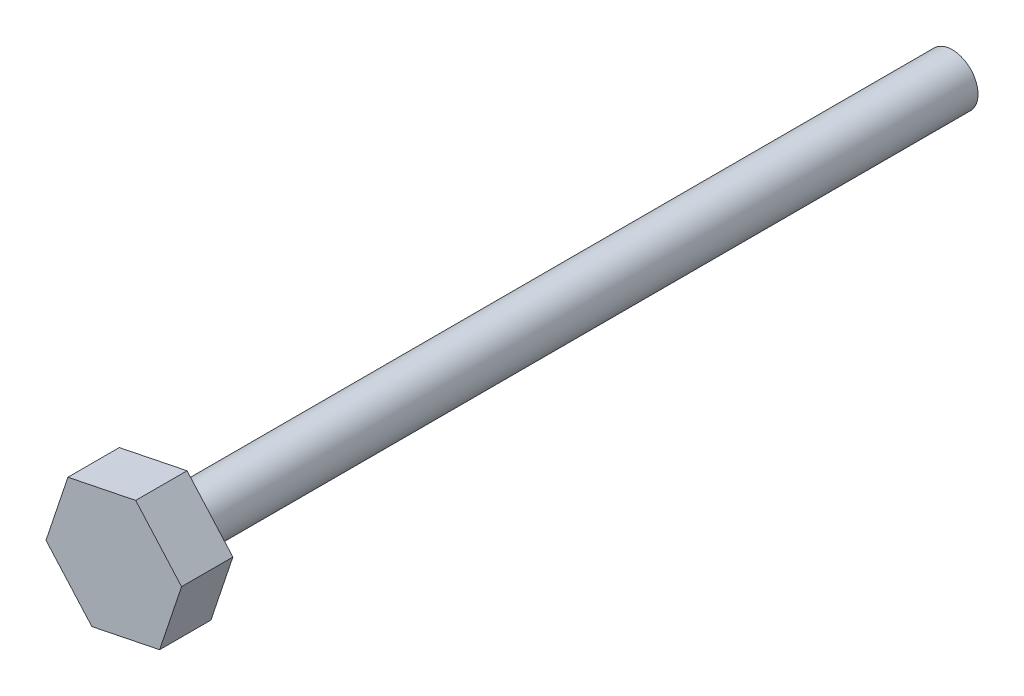
ISO-10303-21;
HEADER;
FILE_DESCRIPTION(('STEP AP214'),'2;1');
FILE_NAME('part.step','',(''),(''),'','','');
FILE_SCHEMA(('AUTOMOTIVE_DESIGN { 1 0 10303 214 1 1 1 1 }'));
ENDSEC;
DATA;
#1=APPLICATION_CONTEXT('core data for automotive mechanical design processes');
#2=APPLICATION_PROTOCOL_DEFINITION('international standard','automotive_design',2000,#1);
#3=PRODUCT_CONTEXT('',#1,'mechanical');
#4=PRODUCT('Part','Part','',(#3));
#5=PRODUCT_RELATED_PRODUCT_CATEGORY('part','',(#4));
#6=PRODUCT_DEFINITION_FORMATION('','',#4);
#7=PRODUCT_DEFINITION_CONTEXT('part definition',#1,'design');
#8=PRODUCT_DEFINITION('design','',#6,#7);
#9=PRODUCT_DEFINITION_SHAPE('','',#8);
#10=(LENGTH_UNIT() NAMED_UNIT(*) SI_UNIT(.MILLI.,.METRE.));
#11=(NAMED_UNIT(*) PLANE_ANGLE_UNIT() SI_UNIT($,.RADIAN.));
#12=(NAMED_UNIT(*) SI_UNIT($,.STERADIAN.) SOLID_ANGLE_UNIT());
#13=UNCERTAINTY_MEASURE_WITH_UNIT(LENGTH_MEASURE(1.E-05),#10,'distance_accuracy_value','');
#14=(GEOMETRIC_REPRESENTATION_CONTEXT(3) GLOBAL_UNCERTAINTY_ASSIGNED_CONTEXT((#13)) GLOBAL_UNIT_ASSIGNED_CONTEXT((#10,
#11,#12)) REPRESENTATION_CONTEXT('',''));
#15=CARTESIAN_POINT('',(0.,0.,0.));
#16=DIRECTION('',(0.,0.,1.));
#17=DIRECTION('',(1.,0.,0.));
#18=AXIS2_PLACEMENT_3D('',#15,#16,#17);
#19=CARTESIAN_POINT('',(0.,0.,46.));
#20=DIRECTION('',(0.,0.,-1.));
#21=DIRECTION('',(-1.,0.,0.));
#22=AXIS2_PLACEMENT_3D('',#19,#20,#21);
#23=CYLINDRICAL_SURFACE('',#22,1.5);
#24=CARTESIAN_POINT('',(0.,0.,46.));
#25=DIRECTION('',(0.,0.,1.));
#26=DIRECTION('',(1.,0.,0.));
#27=AXIS2_PLACEMENT_3D('',#24,#25,#26);
#28=CIRCLE('',#27,1.5);
#29=CARTESIAN_POINT('',(1.5,0.,46.));
#30=VERTEX_POINT('',#29);
#31=EDGE_CURVE('E11',#30,#30,#28,.T.);
#32=ORIENTED_EDGE('',*,*,#31,.F.);
#33=EDGE_LOOP('',(#32));
#34=FACE_BOUND('',#33,.T.);
#35=CARTESIAN_POINT('',(0.,0.,0.));
#36=DIRECTION('',(0.,0.,1.));
#37=DIRECTION('',(1.,0.,0.));
#38=AXIS2_PLACEMENT_3D('',#35,#36,#37);
#39=CIRCLE('',#38,1.5);
#40=CARTESIAN_POINT('',(1.5,0.,0.));
#41=VERTEX_POINT('',#40);
#42=EDGE_CURVE('E36',#41,#41,#39,.T.);
#43=ORIENTED_EDGE('',*,*,#42,.T.);
#44=EDGE_LOOP('',(#43));
#45=FACE_BOUND('',#44,.T.);
#46=ADVANCED_FACE('F33',(#34,#45),#23,.T.);
#47=CARTESIAN_POINT('',(0.,0.,0.));
#48=DIRECTION('',(0.,0.,1.));
#49=DIRECTION('',(1.,0.,0.));
#50=AXIS2_PLACEMENT_3D('',#47,#48,#49);
#51=PLANE('',#50);
#52=ORIENTED_EDGE('',*,*,#42,.F.);
#53=EDGE_LOOP('',(#52));
#54=FACE_BOUND('',#53,.T.);
#55=ADVANCED_FACE('F141',(#54),#51,.F.);
#56=CARTESIAN_POINT('',(3.9601018851663,0.806800094469266,49.));
#57=DIRECTION('',(-0.748777635737627,-0.662821282261795,0.));
#58=DIRECTION('',(0.662821282261795,-0.748777635737627,0.));
#59=AXIS2_PLACEMENT_3D('',#56,#57,#58);
#60=PLANE('',#59);
#61=DIRECTION('',(-0.662821282261795,0.748777635737627,0.));
#62=VECTOR('',#61,1.);
#63=CARTESIAN_POINT('',(3.9601018851663,0.806800094469266,46.));
#64=LINE('',#63,#62);
#65=CARTESIAN_POINT('',(3.9601018851663,0.806800094469266,46.));
#66=VERTEX_POINT('',#65);
#67=CARTESIAN_POINT('',(1.28134156499708,3.8329488813633,46.));
#68=VERTEX_POINT('',#67);
#69=EDGE_CURVE('E118',#66,#68,#64,.T.);
#70=ORIENTED_EDGE('',*,*,#69,.T.);
#71=DIRECTION('',(0.,0.,-1.));
#72=VECTOR('',#71,1.);
#73=CARTESIAN_POINT('',(1.28134156499708,3.8329488813633,49.));
#74=LINE('',#73,#72);
#75=CARTESIAN_POINT('',(1.28134156499708,3.8329488813633,49.));
#76=VERTEX_POINT('',#75);
#77=EDGE_CURVE('E135',#76,#68,#74,.T.);
#78=ORIENTED_EDGE('',*,*,#77,.F.);
#79=DIRECTION('',(-0.662821282261795,0.748777635737627,0.));
#80=VECTOR('',#79,1.);
#81=CARTESIAN_POINT('',(3.9601018851663,0.806800094469266,49.));
#82=LINE('',#81,#80);
#83=CARTESIAN_POINT('',(3.9601018851663,0.806800094469266,49.));
#84=VERTEX_POINT('',#83);
#85=EDGE_CURVE('E128',#84,#76,#82,.T.);
#86=ORIENTED_EDGE('',*,*,#85,.F.);
#87=DIRECTION('',(0.,0.,-1.));
#88=VECTOR('',#87,1.);
#89=CARTESIAN_POINT('',(3.9601018851663,0.806800094469266,49.));
#90=LINE('',#89,#88);
#91=EDGE_CURVE('E114',#84,#66,#90,.T.);
#92=ORIENTED_EDGE('',*,*,#91,.T.);
#93=EDGE_LOOP('',(#70,#78,#86,#92));
#94=FACE_BOUND('',#93,.T.);
#95=ADVANCED_FACE('F143',(#94),#60,.F.);
#96=CARTESIAN_POINT('',(1.28134156499708,3.8329488813633,49.));
#97=DIRECTION('',(0.199631250738877,-0.979871095465333,0.));
#98=DIRECTION('',(0.979871095465333,0.199631250738877,0.));
#99=AXIS2_PLACEMENT_3D('',#96,#97,#98);
#100=PLANE('',#99);
#101=DIRECTION('',(-0.979871095465333,-0.199631250738877,0.));
#102=VECTOR('',#101,1.);
#103=CARTESIAN_POINT('',(1.28134156499708,3.8329488813633,46.));
#104=LINE('',#103,#102);
#105=CARTESIAN_POINT('',(-2.67876032016922,3.02614878689403,46.));
#106=VERTEX_POINT('',#105);
#107=EDGE_CURVE('E121',#68,#106,#104,.T.);
#108=ORIENTED_EDGE('',*,*,#107,.T.);
#109=DIRECTION('',(0.,0.,-1.));
#110=VECTOR('',#109,1.);
#111=CARTESIAN_POINT('',(-2.67876032016922,3.02614878689403,49.));
#112=LINE('',#111,#110);
#113=CARTESIAN_POINT('',(-2.67876032016922,3.02614878689403,49.));
#114=VERTEX_POINT('',#113);
#115=EDGE_CURVE('E132',#114,#106,#112,.T.);
#116=ORIENTED_EDGE('',*,*,#115,.F.);
#117=DIRECTION('',(-0.979871095465333,-0.199631250738877,0.));
#118=VECTOR('',#117,1.);
#119=CARTESIAN_POINT('',(1.28134156499708,3.8329488813633,49.));
#120=LINE('',#119,#118);
#121=EDGE_CURVE('E87',#76,#114,#120,.T.);
#122=ORIENTED_EDGE('',*,*,#121,.F.);
#123=ORIENTED_EDGE('',*,*,#77,.T.);
#124=EDGE_LOOP('',(#108,#116,#122,#123));
#125=FACE_BOUND('',#124,.T.);
#126=ADVANCED_FACE('F148',(#125),#100,.F.);
#127=CARTESIAN_POINT('',(-2.67876032016922,3.02614878689403,49.));
#128=DIRECTION('',(0.948408886476504,-0.317049813203538,0.));
#129=DIRECTION('',(0.317049813203538,0.948408886476504,0.));
#130=AXIS2_PLACEMENT_3D('',#127,#128,#129);
#131=PLANE('',#130);
#132=DIRECTION('',(-0.317049813203538,-0.948408886476504,0.));
#133=VECTOR('',#132,1.);
#134=CARTESIAN_POINT('',(-2.67876032016922,3.02614878689403,46.));
#135=LINE('',#134,#133);
#136=CARTESIAN_POINT('',(-3.9601018851663,-0.806800094469267,46.));
#137=VERTEX_POINT('',#136);
#138=EDGE_CURVE('E123',#106,#137,#135,.T.);
#139=ORIENTED_EDGE('',*,*,#138,.T.);
#140=DIRECTION('',(0.,0.,-1.));
#141=VECTOR('',#140,1.);
#142=CARTESIAN_POINT('',(-3.9601018851663,-0.806800094469267,49.));
#143=LINE('',#142,#141);
#144=CARTESIAN_POINT('',(-3.9601018851663,-0.806800094469267,49.));
#145=VERTEX_POINT('',#144);
#146=EDGE_CURVE('E109',#145,#137,#143,.T.);
#147=ORIENTED_EDGE('',*,*,#146,.F.);
#148=DIRECTION('',(-0.317049813203538,-0.948408886476504,0.));
#149=VECTOR('',#148,1.);
#150=CARTESIAN_POINT('',(-2.67876032016922,3.02614878689403,49.));
#151=LINE('',#150,#149);
#152=EDGE_CURVE('E100',#114,#145,#151,.T.);
#153=ORIENTED_EDGE('',*,*,#152,.F.);
#154=ORIENTED_EDGE('',*,*,#115,.T.);
#155=EDGE_LOOP('',(#139,#147,#153,#154));
#156=FACE_BOUND('',#155,.T.);
#157=ADVANCED_FACE('F155',(#156),#131,.F.);
#158=CARTESIAN_POINT('',(-3.9601018851663,-0.806800094469267,49.));
#159=DIRECTION('',(0.748777635737627,0.662821282261795,0.));
#160=DIRECTION('',(-0.662821282261795,0.748777635737627,0.));
#161=AXIS2_PLACEMENT_3D('',#158,#159,#160);
#162=PLANE('',#161);
#163=DIRECTION('',(0.662821282261795,-0.748777635737627,0.));
#164=VECTOR('',#163,1.);
#165=CARTESIAN_POINT('',(-3.9601018851663,-0.806800094469267,46.));
#166=LINE('',#165,#164);
#167=CARTESIAN_POINT('',(-1.28134156499708,-3.8329488813633,46.));
#168=VERTEX_POINT('',#167);
#169=EDGE_CURVE('E108',#137,#168,#166,.T.);
#170=ORIENTED_EDGE('',*,*,#169,.T.);
#171=DIRECTION('',(0.,0.,-1.));
#172=VECTOR('',#171,1.);
#173=CARTESIAN_POINT('',(-1.28134156499708,-3.8329488813633,49.));
#174=LINE('',#173,#172);
#175=CARTESIAN_POINT('',(-1.28134156499708,-3.8329488813633,49.));
#176=VERTEX_POINT('',#175);
#177=EDGE_CURVE('E105',#176,#168,#174,.T.);
#178=ORIENTED_EDGE('',*,*,#177,.F.);
#179=DIRECTION('',(0.662821282261795,-0.748777635737627,0.));
#180=VECTOR('',#179,1.);
#181=CARTESIAN_POINT('',(-3.9601018851663,-0.806800094469267,49.));
#182=LINE('',#181,#180);
#183=EDGE_CURVE('E94',#145,#176,#182,.T.);
#184=ORIENTED_EDGE('',*,*,#183,.F.);
#185=ORIENTED_EDGE('',*,*,#146,.T.);
#186=EDGE_LOOP('',(#170,#178,#184,#185));
#187=FACE_BOUND('',#186,.T.);
#188=ADVANCED_FACE('F106',(#187),#162,.F.);
#189=CARTESIAN_POINT('',(-1.28134156499708,-3.8329488813633,49.));
#190=DIRECTION('',(-0.199631250738877,0.979871095465333,0.));
#191=DIRECTION('',(-0.979871095465333,-0.199631250738877,0.));
#192=AXIS2_PLACEMENT_3D('',#189,#190,#191);
#193=PLANE('',#192);
#194=DIRECTION('',(0.979871095465333,0.199631250738877,0.));
#195=VECTOR('',#194,1.);
#196=CARTESIAN_POINT('',(-1.28134156499708,-3.8329488813633,46.));
#197=LINE('',#196,#195);
#198=CARTESIAN_POINT('',(2.67876032016922,-3.02614878689403,46.));
#199=VERTEX_POINT('',#198);
#200=EDGE_CURVE('E72',#168,#199,#197,.T.);
#201=ORIENTED_EDGE('',*,*,#200,.T.);
#202=DIRECTION('',(0.,0.,-1.));
#203=VECTOR('',#202,1.);
#204=CARTESIAN_POINT('',(2.67876032016922,-3.02614878689403,49.));
#205=LINE('',#204,#203);
#206=CARTESIAN_POINT('',(2.67876032016922,-3.02614878689403,49.));
#207=VERTEX_POINT('',#206);
#208=EDGE_CURVE('E110',#207,#199,#205,.T.);
#209=ORIENTED_EDGE('',*,*,#208,.F.);
#210=DIRECTION('',(0.979871095465333,0.199631250738877,0.));
#211=VECTOR('',#210,1.);
#212=CARTESIAN_POINT('',(-1.28134156499708,-3.8329488813633,49.));
#213=LINE('',#212,#211);
#214=EDGE_CURVE('E98',#176,#207,#213,.T.);
#215=ORIENTED_EDGE('',*,*,#214,.F.);
#216=ORIENTED_EDGE('',*,*,#177,.T.);
#217=EDGE_LOOP('',(#201,#209,#215,#216));
#218=FACE_BOUND('',#217,.T.);
#219=ADVANCED_FACE('F112',(#218),#193,.F.);
#220=CARTESIAN_POINT('',(2.67876032016922,-3.02614878689403,49.));
#221=DIRECTION('',(-0.948408886476504,0.317049813203538,0.));
#222=DIRECTION('',(-0.317049813203538,-0.948408886476504,0.));
#223=AXIS2_PLACEMENT_3D('',#220,#221,#222);
#224=PLANE('',#223);
#225=DIRECTION('',(0.317049813203538,0.948408886476504,0.));
#226=VECTOR('',#225,1.);
#227=CARTESIAN_POINT('',(2.67876032016922,-3.02614878689403,46.));
#228=LINE('',#227,#226);
#229=EDGE_CURVE('E78',#199,#66,#228,.T.);
#230=ORIENTED_EDGE('',*,*,#229,.T.);
#231=ORIENTED_EDGE('',*,*,#91,.F.);
#232=DIRECTION('',(0.317049813203538,0.948408886476504,0.));
#233=VECTOR('',#232,1.);
#234=CARTESIAN_POINT('',(2.67876032016922,-3.02614878689403,49.));
#235=LINE('',#234,#233);
#236=EDGE_CURVE('E49',#207,#84,#235,.T.);
#237=ORIENTED_EDGE('',*,*,#236,.F.);
#238=ORIENTED_EDGE('',*,*,#208,.T.);
#239=EDGE_LOOP('',(#230,#231,#237,#238));
#240=FACE_BOUND('',#239,.T.);
#241=ADVANCED_FACE('F163',(#240),#224,.F.);
#242=CARTESIAN_POINT('',(0.,0.,49.));
#243=DIRECTION('',(0.,0.,1.));
#244=DIRECTION('',(1.,0.,0.));
#245=AXIS2_PLACEMENT_3D('',#242,#243,#244);
#246=PLANE('',#245);
#247=ORIENTED_EDGE('',*,*,#85,.T.);
#248=ORIENTED_EDGE('',*,*,#121,.T.);
#249=ORIENTED_EDGE('',*,*,#152,.T.);
#250=ORIENTED_EDGE('',*,*,#183,.T.);
#251=ORIENTED_EDGE('',*,*,#214,.T.);
#252=ORIENTED_EDGE('',*,*,#236,.T.);
#253=EDGE_LOOP('',(#247,#248,#249,#250,#251,#252));
#254=FACE_BOUND('',#253,.T.);
#255=ADVANCED_FACE('F96',(#254),#246,.T.);
#256=CARTESIAN_POINT('',(0.,0.,46.));
#257=DIRECTION('',(0.,0.,1.));
#258=DIRECTION('',(1.,0.,0.));
#259=AXIS2_PLACEMENT_3D('',#256,#257,#258);
#260=PLANE('',#259);
#261=ORIENTED_EDGE('',*,*,#31,.T.);
#262=EDGE_LOOP('',(#261));
#263=FACE_BOUND('',#262,.T.);
#264=ORIENTED_EDGE('',*,*,#69,.F.);
#265=ORIENTED_EDGE('',*,*,#229,.F.);
#266=ORIENTED_EDGE('',*,*,#200,.F.);
#267=ORIENTED_EDGE('',*,*,#169,.F.);
#268=ORIENTED_EDGE('',*,*,#138,.F.);
#269=ORIENTED_EDGE('',*,*,#107,.F.);
#270=EDGE_LOOP('',(#264,#265,#266,#267,#268,#269));
#271=FACE_BOUND('',#270,.T.);
#272=ADVANCED_FACE('F166',(#263,#271),#260,.F.);
#273=CLOSED_SHELL('',(#46,#55,#95,#126,#157,#188,#219,#241,#255,#272));
#274=MANIFOLD_SOLID_BREP('B2',#273);
#275=ADVANCED_BREP_SHAPE_REPRESENTATION('',(#18,#274),#14);
#276=SHAPE_DEFINITION_REPRESENTATION(#9,#275);
ENDSEC;
END-ISO-10303-21;
